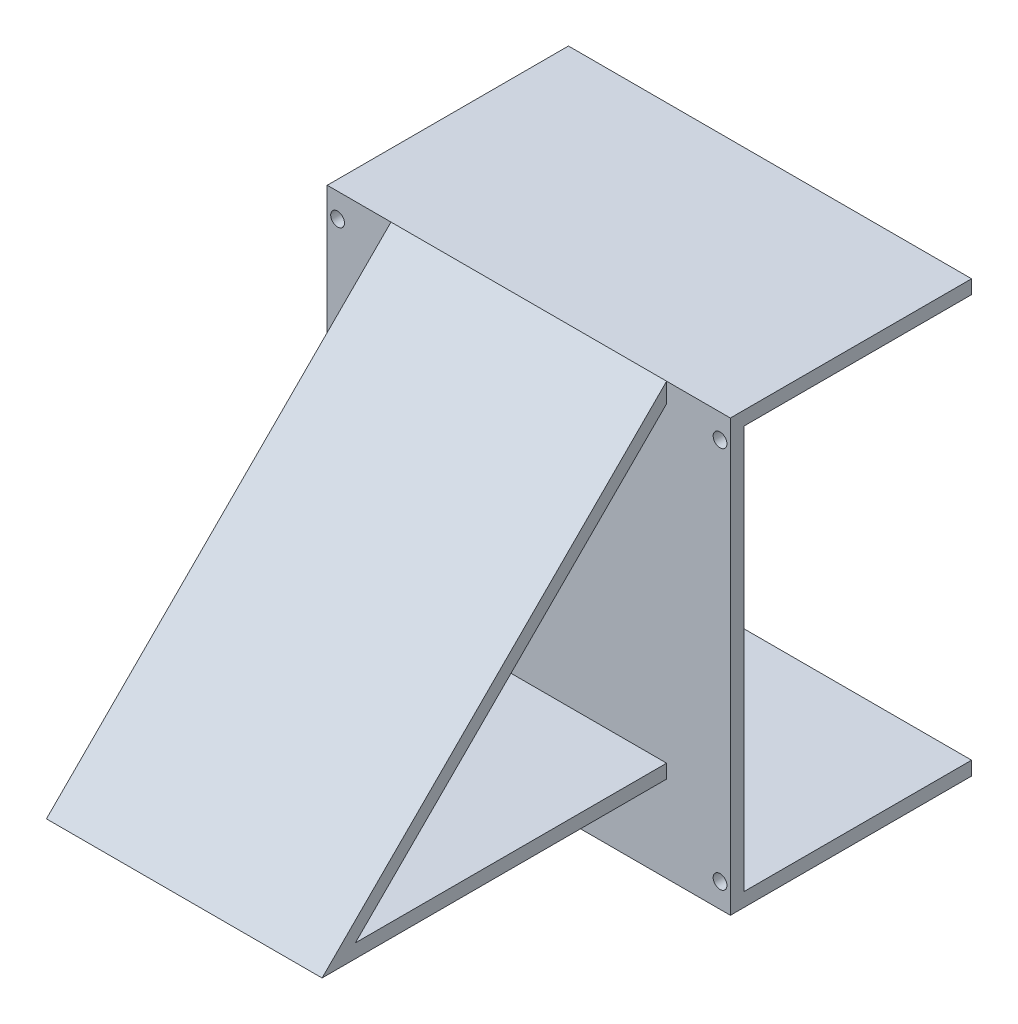
ISO-10303-21;
HEADER;
FILE_DESCRIPTION(('STEP AP214'),'2;1');
FILE_NAME('part.step','',(''),(''),'','','');
FILE_SCHEMA(('AUTOMOTIVE_DESIGN { 1 0 10303 214 1 1 1 1 }'));
ENDSEC;
DATA;
#1=APPLICATION_CONTEXT('core data for automotive mechanical design processes');
#2=APPLICATION_PROTOCOL_DEFINITION('international standard','automotive_design',2000,#1);
#3=PRODUCT_CONTEXT('',#1,'mechanical');
#4=PRODUCT('Part','Part','',(#3));
#5=PRODUCT_RELATED_PRODUCT_CATEGORY('part','',(#4));
#6=PRODUCT_DEFINITION_FORMATION('','',#4);
#7=PRODUCT_DEFINITION_CONTEXT('part definition',#1,'design');
#8=PRODUCT_DEFINITION('design','',#6,#7);
#9=PRODUCT_DEFINITION_SHAPE('','',#8);
#10=(LENGTH_UNIT() NAMED_UNIT(*) SI_UNIT(.MILLI.,.METRE.));
#11=(NAMED_UNIT(*) PLANE_ANGLE_UNIT() SI_UNIT($,.RADIAN.));
#12=(NAMED_UNIT(*) SI_UNIT($,.STERADIAN.) SOLID_ANGLE_UNIT());
#13=UNCERTAINTY_MEASURE_WITH_UNIT(LENGTH_MEASURE(1.E-05),#10,'distance_accuracy_value','');
#14=(GEOMETRIC_REPRESENTATION_CONTEXT(3) GLOBAL_UNCERTAINTY_ASSIGNED_CONTEXT((#13)) GLOBAL_UNIT_ASSIGNED_CONTEXT((#10,
#11,#12)) REPRESENTATION_CONTEXT('',''));
#15=CARTESIAN_POINT('',(0.,0.,0.));
#16=DIRECTION('',(0.,0.,1.));
#17=DIRECTION('',(1.,0.,0.));
#18=AXIS2_PLACEMENT_3D('',#15,#16,#17);
#19=CARTESIAN_POINT('',(0.,0.,0.));
#20=DIRECTION('',(0.,0.,-1.));
#21=DIRECTION('',(-1.,0.,0.));
#22=AXIS2_PLACEMENT_3D('',#19,#20,#21);
#23=PLANE('',#22);
#24=CARTESIAN_POINT('',(114.,118.,0.));
#25=DIRECTION('',(0.,0.,-1.));
#26=DIRECTION('',(-1.,0.,0.));
#27=AXIS2_PLACEMENT_3D('',#24,#25,#26);
#28=CIRCLE('',#27,2.);
#29=CARTESIAN_POINT('',(112.,118.,0.));
#30=VERTEX_POINT('',#29);
#31=EDGE_CURVE('E460',#30,#30,#28,.T.);
#32=ORIENTED_EDGE('',*,*,#31,.F.);
#33=EDGE_LOOP('',(#32));
#34=FACE_BOUND('',#33,.T.);
#35=CARTESIAN_POINT('',(3.,6.99999999999999,0.));
#36=DIRECTION('',(0.,0.,-1.));
#37=DIRECTION('',(-1.,0.,0.));
#38=AXIS2_PLACEMENT_3D('',#35,#36,#37);
#39=CIRCLE('',#38,1.99999999999999);
#40=CARTESIAN_POINT('',(1.00000000000001,6.99999999999999,0.));
#41=VERTEX_POINT('',#40);
#42=EDGE_CURVE('E457',#41,#41,#39,.T.);
#43=ORIENTED_EDGE('',*,*,#42,.F.);
#44=EDGE_LOOP('',(#43));
#45=FACE_BOUND('',#44,.T.);
#46=CARTESIAN_POINT('',(114.,6.99999999999998,0.));
#47=DIRECTION('',(0.,0.,-1.));
#48=DIRECTION('',(-1.,0.,0.));
#49=AXIS2_PLACEMENT_3D('',#46,#47,#48);
#50=CIRCLE('',#49,2.);
#51=CARTESIAN_POINT('',(112.,6.99999999999998,0.));
#52=VERTEX_POINT('',#51);
#53=EDGE_CURVE('E450',#52,#52,#50,.T.);
#54=ORIENTED_EDGE('',*,*,#53,.F.);
#55=EDGE_LOOP('',(#54));
#56=FACE_BOUND('',#55,.T.);
#57=CARTESIAN_POINT('',(3.00000000000002,118.,0.));
#58=DIRECTION('',(0.,0.,-1.));
#59=DIRECTION('',(-1.,0.,0.));
#60=AXIS2_PLACEMENT_3D('',#57,#58,#59);
#61=CIRCLE('',#60,2.);
#62=CARTESIAN_POINT('',(1.00000000000002,118.,0.));
#63=VERTEX_POINT('',#62);
#64=EDGE_CURVE('E168',#63,#63,#61,.T.);
#65=ORIENTED_EDGE('',*,*,#64,.F.);
#66=EDGE_LOOP('',(#65));
#67=FACE_BOUND('',#66,.T.);
#68=DIRECTION('',(0.,-1.,0.));
#69=VECTOR('',#68,1.);
#70=CARTESIAN_POINT('',(117.,125.,0.));
#71=LINE('',#70,#69);
#72=CARTESIAN_POINT('',(117.,121.,0.));
#73=VERTEX_POINT('',#72);
#74=CARTESIAN_POINT('',(117.,4.,0.));
#75=VERTEX_POINT('',#74);
#76=EDGE_CURVE('E233',#73,#75,#71,.T.);
#77=ORIENTED_EDGE('',*,*,#76,.T.);
#78=DIRECTION('',(1.,0.,0.));
#79=VECTOR('',#78,1.);
#80=CARTESIAN_POINT('',(117.,4.,0.));
#81=LINE('',#80,#79);
#82=CARTESIAN_POINT('',(0.,4.,0.));
#83=VERTEX_POINT('',#82);
#84=EDGE_CURVE('E164',#83,#75,#81,.T.);
#85=ORIENTED_EDGE('',*,*,#84,.F.);
#86=DIRECTION('',(0.,-1.,0.));
#87=VECTOR('',#86,1.);
#88=CARTESIAN_POINT('',(0.,125.,0.));
#89=LINE('',#88,#87);
#90=CARTESIAN_POINT('',(0.,121.,0.));
#91=VERTEX_POINT('',#90);
#92=EDGE_CURVE('E236',#91,#83,#89,.T.);
#93=ORIENTED_EDGE('',*,*,#92,.F.);
#94=DIRECTION('',(-1.,0.,0.));
#95=VECTOR('',#94,1.);
#96=CARTESIAN_POINT('',(117.,121.,0.));
#97=LINE('',#96,#95);
#98=EDGE_CURVE('E60',#73,#91,#97,.T.);
#99=ORIENTED_EDGE('',*,*,#98,.F.);
#100=EDGE_LOOP('',(#77,#85,#93,#99));
#101=FACE_BOUND('',#100,.T.);
#102=ADVANCED_FACE('F35',(#34,#45,#56,#67,#101),#23,.T.);
#103=CARTESIAN_POINT('',(18.5,125.,104.));
#104=DIRECTION('',(1.,0.,0.));
#105=DIRECTION('',(0.,0.,-1.));
#106=AXIS2_PLACEMENT_3D('',#103,#104,#105);
#107=PLANE('',#106);
#108=DIRECTION('',(0.,0.,-1.));
#109=VECTOR('',#108,1.);
#110=CARTESIAN_POINT('',(18.5,29.,94.3431457505076));
#111=LINE('',#110,#109);
#112=CARTESIAN_POINT('',(18.5,29.,94.3431457505076));
#113=VERTEX_POINT('',#112);
#114=CARTESIAN_POINT('',(18.5,29.,4.));
#115=VERTEX_POINT('',#114);
#116=EDGE_CURVE('E194',#113,#115,#111,.T.);
#117=ORIENTED_EDGE('',*,*,#116,.T.);
#118=DIRECTION('',(0.,-1.,0.));
#119=VECTOR('',#118,1.);
#120=CARTESIAN_POINT('',(18.5,125.,4.));
#121=LINE('',#120,#119);
#122=CARTESIAN_POINT('',(18.5,25.,4.));
#123=VERTEX_POINT('',#122);
#124=EDGE_CURVE('E214',#115,#123,#121,.T.);
#125=ORIENTED_EDGE('',*,*,#124,.T.);
#126=DIRECTION('',(0.,0.,-1.));
#127=VECTOR('',#126,1.);
#128=CARTESIAN_POINT('',(18.5,25.,104.));
#129=LINE('',#128,#127);
#130=CARTESIAN_POINT('',(18.5,25.,104.));
#131=VERTEX_POINT('',#130);
#132=EDGE_CURVE('E230',#131,#123,#129,.T.);
#133=ORIENTED_EDGE('',*,*,#132,.F.);
#134=DIRECTION('',(0.,-0.707106781186547,0.707106781186547));
#135=VECTOR('',#134,1.);
#136=CARTESIAN_POINT('',(18.5,125.,4.));
#137=LINE('',#136,#135);
#138=CARTESIAN_POINT('',(18.5,125.,4.));
#139=VERTEX_POINT('',#138);
#140=EDGE_CURVE('E207',#139,#131,#137,.T.);
#141=ORIENTED_EDGE('',*,*,#140,.F.);
#142=CARTESIAN_POINT('',(18.5,119.343145750508,4.));
#143=VERTEX_POINT('',#142);
#144=EDGE_CURVE('E219',#139,#143,#121,.T.);
#145=ORIENTED_EDGE('',*,*,#144,.T.);
#146=DIRECTION('',(0.,-0.707106781186548,0.707106781186547));
#147=VECTOR('',#146,1.);
#148=CARTESIAN_POINT('',(18.5,119.343145750508,4.));
#149=LINE('',#148,#147);
#150=EDGE_CURVE('E197',#143,#113,#149,.T.);
#151=ORIENTED_EDGE('',*,*,#150,.T.);
#152=EDGE_LOOP('',(#117,#125,#133,#141,#145,#151));
#153=FACE_BOUND('',#152,.T.);
#154=ADVANCED_FACE('F280',(#153),#107,.F.);
#155=CARTESIAN_POINT('',(98.5,125.,104.));
#156=DIRECTION('',(-1.,0.,0.));
#157=DIRECTION('',(0.,0.,1.));
#158=AXIS2_PLACEMENT_3D('',#155,#156,#157);
#159=PLANE('',#158);
#160=DIRECTION('',(0.,0.,-1.));
#161=VECTOR('',#160,1.);
#162=CARTESIAN_POINT('',(98.5,29.,104.));
#163=LINE('',#162,#161);
#164=CARTESIAN_POINT('',(98.5,29.,94.3431457505076));
#165=VERTEX_POINT('',#164);
#166=CARTESIAN_POINT('',(98.5,29.,4.));
#167=VERTEX_POINT('',#166);
#168=EDGE_CURVE('E11',#165,#167,#163,.T.);
#169=ORIENTED_EDGE('',*,*,#168,.F.);
#170=DIRECTION('',(0.,-0.707106781186548,0.707106781186547));
#171=VECTOR('',#170,1.);
#172=CARTESIAN_POINT('',(98.5,72.1715728752538,51.1715728752538));
#173=LINE('',#172,#171);
#174=CARTESIAN_POINT('',(98.5,119.343145750508,3.99999999999999));
#175=VERTEX_POINT('',#174);
#176=EDGE_CURVE('E44',#175,#165,#173,.T.);
#177=ORIENTED_EDGE('',*,*,#176,.F.);
#178=DIRECTION('',(0.,1.,0.));
#179=VECTOR('',#178,1.);
#180=CARTESIAN_POINT('',(98.5,125.,4.));
#181=LINE('',#180,#179);
#182=CARTESIAN_POINT('',(98.5,125.,4.));
#183=VERTEX_POINT('',#182);
#184=EDGE_CURVE('E225',#175,#183,#181,.T.);
#185=ORIENTED_EDGE('',*,*,#184,.T.);
#186=DIRECTION('',(0.,-0.707106781186548,0.707106781186548));
#187=VECTOR('',#186,1.);
#188=CARTESIAN_POINT('',(98.5,75.,54.));
#189=LINE('',#188,#187);
#190=CARTESIAN_POINT('',(98.5,25.,104.));
#191=VERTEX_POINT('',#190);
#192=EDGE_CURVE('E211',#183,#191,#189,.T.);
#193=ORIENTED_EDGE('',*,*,#192,.T.);
#194=DIRECTION('',(0.,0.,-1.));
#195=VECTOR('',#194,1.);
#196=CARTESIAN_POINT('',(98.5,25.,104.));
#197=LINE('',#196,#195);
#198=CARTESIAN_POINT('',(98.5,25.,4.));
#199=VERTEX_POINT('',#198);
#200=EDGE_CURVE('E217',#191,#199,#197,.T.);
#201=ORIENTED_EDGE('',*,*,#200,.T.);
#202=EDGE_CURVE('E218',#199,#167,#181,.T.);
#203=ORIENTED_EDGE('',*,*,#202,.T.);
#204=EDGE_LOOP('',(#169,#177,#185,#193,#201,#203));
#205=FACE_BOUND('',#204,.T.);
#206=ADVANCED_FACE('F286',(#205),#159,.F.);
#207=CARTESIAN_POINT('',(0.,0.,4.));
#208=DIRECTION('',(0.,0.,-1.));
#209=DIRECTION('',(-1.,0.,0.));
#210=AXIS2_PLACEMENT_3D('',#207,#208,#209);
#211=PLANE('',#210);
#212=CARTESIAN_POINT('',(114.,118.,4.));
#213=DIRECTION('',(0.,0.,-1.));
#214=DIRECTION('',(-1.,0.,0.));
#215=AXIS2_PLACEMENT_3D('',#212,#213,#214);
#216=CIRCLE('',#215,2.);
#217=CARTESIAN_POINT('',(112.,118.,4.));
#218=VERTEX_POINT('',#217);
#219=EDGE_CURVE('E39',#218,#218,#216,.T.);
#220=ORIENTED_EDGE('',*,*,#219,.T.);
#221=EDGE_LOOP('',(#220));
#222=FACE_BOUND('',#221,.T.);
#223=CARTESIAN_POINT('',(3.,6.99999999999999,4.));
#224=DIRECTION('',(0.,0.,-1.));
#225=DIRECTION('',(-1.,0.,0.));
#226=AXIS2_PLACEMENT_3D('',#223,#224,#225);
#227=CIRCLE('',#226,1.99999999999999);
#228=CARTESIAN_POINT('',(1.00000000000001,6.99999999999999,4.));
#229=VERTEX_POINT('',#228);
#230=EDGE_CURVE('E257',#229,#229,#227,.T.);
#231=ORIENTED_EDGE('',*,*,#230,.T.);
#232=EDGE_LOOP('',(#231));
#233=FACE_BOUND('',#232,.T.);
#234=CARTESIAN_POINT('',(114.,6.99999999999998,4.));
#235=DIRECTION('',(0.,0.,-1.));
#236=DIRECTION('',(-1.,0.,0.));
#237=AXIS2_PLACEMENT_3D('',#234,#235,#236);
#238=CIRCLE('',#237,2.);
#239=CARTESIAN_POINT('',(112.,6.99999999999998,4.));
#240=VERTEX_POINT('',#239);
#241=EDGE_CURVE('E255',#240,#240,#238,.T.);
#242=ORIENTED_EDGE('',*,*,#241,.T.);
#243=EDGE_LOOP('',(#242));
#244=FACE_BOUND('',#243,.T.);
#245=CARTESIAN_POINT('',(3.00000000000002,118.,4.));
#246=DIRECTION('',(0.,0.,-1.));
#247=DIRECTION('',(-1.,0.,0.));
#248=AXIS2_PLACEMENT_3D('',#245,#246,#247);
#249=CIRCLE('',#248,2.);
#250=CARTESIAN_POINT('',(1.00000000000002,118.,4.));
#251=VERTEX_POINT('',#250);
#252=EDGE_CURVE('E252',#251,#251,#249,.T.);
#253=ORIENTED_EDGE('',*,*,#252,.T.);
#254=EDGE_LOOP('',(#253));
#255=FACE_BOUND('',#254,.T.);
#256=DIRECTION('',(1.,0.,0.));
#257=VECTOR('',#256,1.);
#258=CARTESIAN_POINT('',(0.,0.,4.));
#259=LINE('',#258,#257);
#260=CARTESIAN_POINT('',(0.,0.,4.));
#261=VERTEX_POINT('',#260);
#262=CARTESIAN_POINT('',(117.,0.,4.));
#263=VERTEX_POINT('',#262);
#264=EDGE_CURVE('E234',#261,#263,#259,.T.);
#265=ORIENTED_EDGE('',*,*,#264,.T.);
#266=DIRECTION('',(0.,-1.,0.));
#267=VECTOR('',#266,1.);
#268=CARTESIAN_POINT('',(117.,125.,4.));
#269=LINE('',#268,#267);
#270=CARTESIAN_POINT('',(117.,125.,4.));
#271=VERTEX_POINT('',#270);
#272=EDGE_CURVE('E147',#271,#263,#269,.T.);
#273=ORIENTED_EDGE('',*,*,#272,.F.);
#274=DIRECTION('',(1.,0.,0.));
#275=VECTOR('',#274,1.);
#276=CARTESIAN_POINT('',(0.,125.,4.));
#277=LINE('',#276,#275);
#278=EDGE_CURVE('E238',#183,#271,#277,.T.);
#279=ORIENTED_EDGE('',*,*,#278,.F.);
#280=ORIENTED_EDGE('',*,*,#184,.F.);
#281=DIRECTION('',(-1.,0.,0.));
#282=VECTOR('',#281,1.);
#283=CARTESIAN_POINT('',(118.5,119.343145750508,4.));
#284=LINE('',#283,#282);
#285=EDGE_CURVE('E203',#175,#143,#284,.T.);
#286=ORIENTED_EDGE('',*,*,#285,.T.);
#287=ORIENTED_EDGE('',*,*,#144,.F.);
#288=CARTESIAN_POINT('',(0.,125.,4.));
#289=VERTEX_POINT('',#288);
#290=EDGE_CURVE('E239',#289,#139,#277,.T.);
#291=ORIENTED_EDGE('',*,*,#290,.F.);
#292=DIRECTION('',(0.,-1.,0.));
#293=VECTOR('',#292,1.);
#294=CARTESIAN_POINT('',(0.,125.,4.));
#295=LINE('',#294,#293);
#296=EDGE_CURVE('E242',#289,#261,#295,.T.);
#297=ORIENTED_EDGE('',*,*,#296,.T.);
#298=EDGE_LOOP('',(#265,#273,#279,#280,#286,#287,#291,#297));
#299=FACE_BOUND('',#298,.T.);
#300=DIRECTION('',(-1.,0.,0.));
#301=VECTOR('',#300,1.);
#302=CARTESIAN_POINT('',(118.5,29.,4.));
#303=LINE('',#302,#301);
#304=EDGE_CURVE('E205',#167,#115,#303,.T.);
#305=ORIENTED_EDGE('',*,*,#304,.F.);
#306=ORIENTED_EDGE('',*,*,#202,.F.);
#307=DIRECTION('',(1.,0.,0.));
#308=VECTOR('',#307,1.);
#309=CARTESIAN_POINT('',(18.5,25.,4.));
#310=LINE('',#309,#308);
#311=EDGE_CURVE('E222',#123,#199,#310,.T.);
#312=ORIENTED_EDGE('',*,*,#311,.F.);
#313=ORIENTED_EDGE('',*,*,#124,.F.);
#314=EDGE_LOOP('',(#305,#306,#312,#313));
#315=FACE_BOUND('',#314,.T.);
#316=ADVANCED_FACE('F264',(#222,#233,#244,#255,#299,#315),#211,.F.);
#317=CARTESIAN_POINT('',(0.,0.,4.));
#318=DIRECTION('',(0.,1.,0.));
#319=DIRECTION('',(0.,0.,1.));
#320=AXIS2_PLACEMENT_3D('',#317,#318,#319);
#321=PLANE('',#320);
#322=DIRECTION('',(0.,0.,-1.));
#323=VECTOR('',#322,1.);
#324=CARTESIAN_POINT('',(0.,0.,4.));
#325=LINE('',#324,#323);
#326=CARTESIAN_POINT('',(0.,0.,-66.));
#327=VERTEX_POINT('',#326);
#328=EDGE_CURVE('E156',#261,#327,#325,.T.);
#329=ORIENTED_EDGE('',*,*,#328,.T.);
#330=DIRECTION('',(-1.,0.,0.));
#331=VECTOR('',#330,1.);
#332=CARTESIAN_POINT('',(117.,0.,-66.));
#333=LINE('',#332,#331);
#334=CARTESIAN_POINT('',(117.,0.,-66.));
#335=VERTEX_POINT('',#334);
#336=EDGE_CURVE('E154',#335,#327,#333,.T.);
#337=ORIENTED_EDGE('',*,*,#336,.F.);
#338=DIRECTION('',(0.,0.,-1.));
#339=VECTOR('',#338,1.);
#340=CARTESIAN_POINT('',(117.,0.,4.));
#341=LINE('',#340,#339);
#342=EDGE_CURVE('E139',#263,#335,#341,.T.);
#343=ORIENTED_EDGE('',*,*,#342,.F.);
#344=ORIENTED_EDGE('',*,*,#264,.F.);
#345=EDGE_LOOP('',(#329,#337,#343,#344));
#346=FACE_BOUND('',#345,.T.);
#347=ADVANCED_FACE('F37',(#346),#321,.F.);
#348=CARTESIAN_POINT('',(117.,125.,4.));
#349=DIRECTION('',(1.,0.,0.));
#350=DIRECTION('',(0.,0.,-1.));
#351=AXIS2_PLACEMENT_3D('',#348,#349,#350);
#352=PLANE('',#351);
#353=ORIENTED_EDGE('',*,*,#76,.F.);
#354=DIRECTION('',(0.,0.,1.));
#355=VECTOR('',#354,1.);
#356=CARTESIAN_POINT('',(117.,121.,-66.));
#357=LINE('',#356,#355);
#358=CARTESIAN_POINT('',(117.,121.,-66.));
#359=VERTEX_POINT('',#358);
#360=EDGE_CURVE('E191',#359,#73,#357,.T.);
#361=ORIENTED_EDGE('',*,*,#360,.F.);
#362=DIRECTION('',(0.,-1.,0.));
#363=VECTOR('',#362,1.);
#364=CARTESIAN_POINT('',(117.,121.,-66.));
#365=LINE('',#364,#363);
#366=CARTESIAN_POINT('',(117.,125.,-66.));
#367=VERTEX_POINT('',#366);
#368=EDGE_CURVE('E176',#367,#359,#365,.T.);
#369=ORIENTED_EDGE('',*,*,#368,.F.);
#370=DIRECTION('',(0.,0.,-1.));
#371=VECTOR('',#370,1.);
#372=CARTESIAN_POINT('',(117.,125.,4.));
#373=LINE('',#372,#371);
#374=EDGE_CURVE('E151',#271,#367,#373,.T.);
#375=ORIENTED_EDGE('',*,*,#374,.F.);
#376=ORIENTED_EDGE('',*,*,#272,.T.);
#377=ORIENTED_EDGE('',*,*,#342,.T.);
#378=DIRECTION('',(0.,-1.,0.));
#379=VECTOR('',#378,1.);
#380=CARTESIAN_POINT('',(117.,4.,-66.));
#381=LINE('',#380,#379);
#382=CARTESIAN_POINT('',(117.,4.,-66.));
#383=VERTEX_POINT('',#382);
#384=EDGE_CURVE('E144',#383,#335,#381,.T.);
#385=ORIENTED_EDGE('',*,*,#384,.F.);
#386=DIRECTION('',(0.,0.,1.));
#387=VECTOR('',#386,1.);
#388=CARTESIAN_POINT('',(117.,4.,-66.));
#389=LINE('',#388,#387);
#390=EDGE_CURVE('E172',#383,#75,#389,.T.);
#391=ORIENTED_EDGE('',*,*,#390,.T.);
#392=EDGE_LOOP('',(#353,#361,#369,#375,#376,#377,#385,#391));
#393=FACE_BOUND('',#392,.T.);
#394=ADVANCED_FACE('F141',(#393),#352,.T.);
#395=CARTESIAN_POINT('',(0.,125.,4.));
#396=DIRECTION('',(0.,1.,0.));
#397=DIRECTION('',(0.,0.,1.));
#398=AXIS2_PLACEMENT_3D('',#395,#396,#397);
#399=PLANE('',#398);
#400=DIRECTION('',(-1.,0.,0.));
#401=VECTOR('',#400,1.);
#402=CARTESIAN_POINT('',(118.5,125.,4.));
#403=LINE('',#402,#401);
#404=EDGE_CURVE('E209',#183,#139,#403,.T.);
#405=ORIENTED_EDGE('',*,*,#404,.F.);
#406=ORIENTED_EDGE('',*,*,#278,.T.);
#407=ORIENTED_EDGE('',*,*,#374,.T.);
#408=DIRECTION('',(1.,0.,0.));
#409=VECTOR('',#408,1.);
#410=CARTESIAN_POINT('',(117.,125.,-66.));
#411=LINE('',#410,#409);
#412=CARTESIAN_POINT('',(0.,125.,-66.));
#413=VERTEX_POINT('',#412);
#414=EDGE_CURVE('E184',#413,#367,#411,.T.);
#415=ORIENTED_EDGE('',*,*,#414,.F.);
#416=DIRECTION('',(0.,0.,-1.));
#417=VECTOR('',#416,1.);
#418=CARTESIAN_POINT('',(0.,125.,4.));
#419=LINE('',#418,#417);
#420=EDGE_CURVE('E248',#289,#413,#419,.T.);
#421=ORIENTED_EDGE('',*,*,#420,.F.);
#422=ORIENTED_EDGE('',*,*,#290,.T.);
#423=EDGE_LOOP('',(#405,#406,#407,#415,#421,#422));
#424=FACE_BOUND('',#423,.T.);
#425=ADVANCED_FACE('F297',(#424),#399,.T.);
#426=CARTESIAN_POINT('',(0.,125.,4.));
#427=DIRECTION('',(1.,0.,0.));
#428=DIRECTION('',(0.,0.,-1.));
#429=AXIS2_PLACEMENT_3D('',#426,#427,#428);
#430=PLANE('',#429);
#431=ORIENTED_EDGE('',*,*,#420,.T.);
#432=DIRECTION('',(0.,1.,0.));
#433=VECTOR('',#432,1.);
#434=CARTESIAN_POINT('',(0.,121.,-66.));
#435=LINE('',#434,#433);
#436=CARTESIAN_POINT('',(0.,121.,-66.));
#437=VERTEX_POINT('',#436);
#438=EDGE_CURVE('E181',#437,#413,#435,.T.);
#439=ORIENTED_EDGE('',*,*,#438,.F.);
#440=DIRECTION('',(0.,0.,1.));
#441=VECTOR('',#440,1.);
#442=CARTESIAN_POINT('',(0.,121.,-66.));
#443=LINE('',#442,#441);
#444=EDGE_CURVE('E187',#437,#91,#443,.T.);
#445=ORIENTED_EDGE('',*,*,#444,.T.);
#446=ORIENTED_EDGE('',*,*,#92,.T.);
#447=DIRECTION('',(0.,0.,1.));
#448=VECTOR('',#447,1.);
#449=CARTESIAN_POINT('',(0.,4.,-66.));
#450=LINE('',#449,#448);
#451=CARTESIAN_POINT('',(0.,4.,-66.));
#452=VERTEX_POINT('',#451);
#453=EDGE_CURVE('E52',#452,#83,#450,.T.);
#454=ORIENTED_EDGE('',*,*,#453,.F.);
#455=DIRECTION('',(0.,1.,0.));
#456=VECTOR('',#455,1.);
#457=CARTESIAN_POINT('',(0.,4.,-66.));
#458=LINE('',#457,#456);
#459=EDGE_CURVE('E159',#327,#452,#458,.T.);
#460=ORIENTED_EDGE('',*,*,#459,.F.);
#461=ORIENTED_EDGE('',*,*,#328,.F.);
#462=ORIENTED_EDGE('',*,*,#296,.F.);
#463=EDGE_LOOP('',(#431,#439,#445,#446,#454,#460,#461,#462));
#464=FACE_BOUND('',#463,.T.);
#465=ADVANCED_FACE('F293',(#464),#430,.F.);
#466=CARTESIAN_POINT('',(18.5,25.,104.));
#467=DIRECTION('',(0.,1.,0.));
#468=DIRECTION('',(0.,0.,1.));
#469=AXIS2_PLACEMENT_3D('',#466,#467,#468);
#470=PLANE('',#469);
#471=ORIENTED_EDGE('',*,*,#311,.T.);
#472=ORIENTED_EDGE('',*,*,#200,.F.);
#473=DIRECTION('',(1.,0.,0.));
#474=VECTOR('',#473,1.);
#475=CARTESIAN_POINT('',(18.5,25.,104.));
#476=LINE('',#475,#474);
#477=EDGE_CURVE('E215',#131,#191,#476,.T.);
#478=ORIENTED_EDGE('',*,*,#477,.F.);
#479=ORIENTED_EDGE('',*,*,#132,.T.);
#480=EDGE_LOOP('',(#471,#472,#478,#479));
#481=FACE_BOUND('',#480,.T.);
#482=ADVANCED_FACE('F296',(#481),#470,.F.);
#483=CARTESIAN_POINT('',(118.5,125.,4.));
#484=DIRECTION('',(0.,-0.707106781186547,-0.707106781186547));
#485=DIRECTION('',(0.,0.707106781186548,-0.707106781186548));
#486=AXIS2_PLACEMENT_3D('',#483,#484,#485);
#487=PLANE('',#486);
#488=ORIENTED_EDGE('',*,*,#404,.T.);
#489=ORIENTED_EDGE('',*,*,#140,.T.);
#490=ORIENTED_EDGE('',*,*,#477,.T.);
#491=ORIENTED_EDGE('',*,*,#192,.F.);
#492=EDGE_LOOP('',(#488,#489,#490,#491));
#493=FACE_BOUND('',#492,.T.);
#494=ADVANCED_FACE('F318',(#493),#487,.F.);
#495=CARTESIAN_POINT('',(118.5,29.,94.3431457505076));
#496=DIRECTION('',(0.,1.,0.));
#497=DIRECTION('',(0.,0.,1.));
#498=AXIS2_PLACEMENT_3D('',#495,#496,#497);
#499=PLANE('',#498);
#500=ORIENTED_EDGE('',*,*,#168,.T.);
#501=ORIENTED_EDGE('',*,*,#304,.T.);
#502=ORIENTED_EDGE('',*,*,#116,.F.);
#503=DIRECTION('',(-1.,0.,0.));
#504=VECTOR('',#503,1.);
#505=CARTESIAN_POINT('',(118.5,29.,94.3431457505076));
#506=LINE('',#505,#504);
#507=EDGE_CURVE('E200',#165,#113,#506,.T.);
#508=ORIENTED_EDGE('',*,*,#507,.F.);
#509=EDGE_LOOP('',(#500,#501,#502,#508));
#510=FACE_BOUND('',#509,.T.);
#511=ADVANCED_FACE('F325',(#510),#499,.T.);
#512=CARTESIAN_POINT('',(118.5,119.343145750508,4.));
#513=DIRECTION('',(0.,-0.707106781186547,-0.707106781186548));
#514=DIRECTION('',(0.,0.707106781186548,-0.707106781186547));
#515=AXIS2_PLACEMENT_3D('',#512,#513,#514);
#516=PLANE('',#515);
#517=ORIENTED_EDGE('',*,*,#176,.T.);
#518=ORIENTED_EDGE('',*,*,#507,.T.);
#519=ORIENTED_EDGE('',*,*,#150,.F.);
#520=ORIENTED_EDGE('',*,*,#285,.F.);
#521=EDGE_LOOP('',(#517,#518,#519,#520));
#522=FACE_BOUND('',#521,.T.);
#523=ADVANCED_FACE('F360',(#522),#516,.T.);
#524=CARTESIAN_POINT('',(117.,121.,-66.));
#525=DIRECTION('',(0.,1.,0.));
#526=DIRECTION('',(0.,0.,1.));
#527=AXIS2_PLACEMENT_3D('',#524,#525,#526);
#528=PLANE('',#527);
#529=ORIENTED_EDGE('',*,*,#98,.T.);
#530=ORIENTED_EDGE('',*,*,#444,.F.);
#531=DIRECTION('',(-1.,0.,0.));
#532=VECTOR('',#531,1.);
#533=CARTESIAN_POINT('',(117.,121.,-66.));
#534=LINE('',#533,#532);
#535=EDGE_CURVE('E179',#359,#437,#534,.T.);
#536=ORIENTED_EDGE('',*,*,#535,.F.);
#537=ORIENTED_EDGE('',*,*,#360,.T.);
#538=EDGE_LOOP('',(#529,#530,#536,#537));
#539=FACE_BOUND('',#538,.T.);
#540=ADVANCED_FACE('F347',(#539),#528,.F.);
#541=CARTESIAN_POINT('',(0.,0.,-66.));
#542=DIRECTION('',(0.,0.,1.));
#543=DIRECTION('',(1.,0.,0.));
#544=AXIS2_PLACEMENT_3D('',#541,#542,#543);
#545=PLANE('',#544);
#546=ORIENTED_EDGE('',*,*,#368,.T.);
#547=ORIENTED_EDGE('',*,*,#535,.T.);
#548=ORIENTED_EDGE('',*,*,#438,.T.);
#549=ORIENTED_EDGE('',*,*,#414,.T.);
#550=EDGE_LOOP('',(#546,#547,#548,#549));
#551=FACE_BOUND('',#550,.T.);
#552=ADVANCED_FACE('F351',(#551),#545,.F.);
#553=CARTESIAN_POINT('',(117.,4.,-66.));
#554=DIRECTION('',(0.,-1.,0.));
#555=DIRECTION('',(0.,0.,-1.));
#556=AXIS2_PLACEMENT_3D('',#553,#554,#555);
#557=PLANE('',#556);
#558=ORIENTED_EDGE('',*,*,#84,.T.);
#559=ORIENTED_EDGE('',*,*,#390,.F.);
#560=DIRECTION('',(1.,0.,0.));
#561=VECTOR('',#560,1.);
#562=CARTESIAN_POINT('',(117.,4.,-66.));
#563=LINE('',#562,#561);
#564=EDGE_CURVE('E162',#452,#383,#563,.T.);
#565=ORIENTED_EDGE('',*,*,#564,.F.);
#566=ORIENTED_EDGE('',*,*,#453,.T.);
#567=EDGE_LOOP('',(#558,#559,#565,#566));
#568=FACE_BOUND('',#567,.T.);
#569=ADVANCED_FACE('F343',(#568),#557,.F.);
#570=CARTESIAN_POINT('',(0.,0.,-66.));
#571=DIRECTION('',(0.,0.,-1.));
#572=DIRECTION('',(-1.,0.,0.));
#573=AXIS2_PLACEMENT_3D('',#570,#571,#572);
#574=PLANE('',#573);
#575=ORIENTED_EDGE('',*,*,#384,.T.);
#576=ORIENTED_EDGE('',*,*,#336,.T.);
#577=ORIENTED_EDGE('',*,*,#459,.T.);
#578=ORIENTED_EDGE('',*,*,#564,.T.);
#579=EDGE_LOOP('',(#575,#576,#577,#578));
#580=FACE_BOUND('',#579,.T.);
#581=ADVANCED_FACE('F161',(#580),#574,.T.);
#582=CARTESIAN_POINT('',(3.00000000000002,118.,70.));
#583=DIRECTION('',(0.,0.,-1.));
#584=DIRECTION('',(-1.,0.,0.));
#585=AXIS2_PLACEMENT_3D('',#582,#583,#584);
#586=CYLINDRICAL_SURFACE('',#585,2.);
#587=ORIENTED_EDGE('',*,*,#64,.T.);
#588=EDGE_LOOP('',(#587));
#589=FACE_BOUND('',#588,.T.);
#590=ORIENTED_EDGE('',*,*,#252,.F.);
#591=EDGE_LOOP('',(#590));
#592=FACE_BOUND('',#591,.T.);
#593=ADVANCED_FACE('F405',(#589,#592),#586,.F.);
#594=CARTESIAN_POINT('',(114.,6.99999999999998,70.));
#595=DIRECTION('',(0.,0.,-1.));
#596=DIRECTION('',(-1.,0.,0.));
#597=AXIS2_PLACEMENT_3D('',#594,#595,#596);
#598=CYLINDRICAL_SURFACE('',#597,2.);
#599=ORIENTED_EDGE('',*,*,#53,.T.);
#600=EDGE_LOOP('',(#599));
#601=FACE_BOUND('',#600,.T.);
#602=ORIENTED_EDGE('',*,*,#241,.F.);
#603=EDGE_LOOP('',(#602));
#604=FACE_BOUND('',#603,.T.);
#605=ADVANCED_FACE('F274',(#601,#604),#598,.F.);
#606=CARTESIAN_POINT('',(3.,6.99999999999999,70.));
#607=DIRECTION('',(0.,0.,-1.));
#608=DIRECTION('',(-1.,0.,0.));
#609=AXIS2_PLACEMENT_3D('',#606,#607,#608);
#610=CYLINDRICAL_SURFACE('',#609,1.99999999999999);
#611=ORIENTED_EDGE('',*,*,#42,.T.);
#612=EDGE_LOOP('',(#611));
#613=FACE_BOUND('',#612,.T.);
#614=ORIENTED_EDGE('',*,*,#230,.F.);
#615=EDGE_LOOP('',(#614));
#616=FACE_BOUND('',#615,.T.);
#617=ADVANCED_FACE('F268',(#613,#616),#610,.F.);
#618=CARTESIAN_POINT('',(114.,118.,70.));
#619=DIRECTION('',(0.,0.,-1.));
#620=DIRECTION('',(-1.,0.,0.));
#621=AXIS2_PLACEMENT_3D('',#618,#619,#620);
#622=CYLINDRICAL_SURFACE('',#621,2.);
#623=ORIENTED_EDGE('',*,*,#31,.T.);
#624=EDGE_LOOP('',(#623));
#625=FACE_BOUND('',#624,.T.);
#626=ORIENTED_EDGE('',*,*,#219,.F.);
#627=EDGE_LOOP('',(#626));
#628=FACE_BOUND('',#627,.T.);
#629=ADVANCED_FACE('F266',(#625,#628),#622,.F.);
#630=CLOSED_SHELL('',(#102,#154,#206,#316,#347,#394,#425,#465,#482,#494,#511,#523,#540,#552,
#569,#581,#593,#605,#617,#629));
#631=MANIFOLD_SOLID_BREP('B2',#630);
#632=ADVANCED_BREP_SHAPE_REPRESENTATION('',(#18,#631),#14);
#633=SHAPE_DEFINITION_REPRESENTATION(#9,#632);
ENDSEC;
END-ISO-10303-21;
